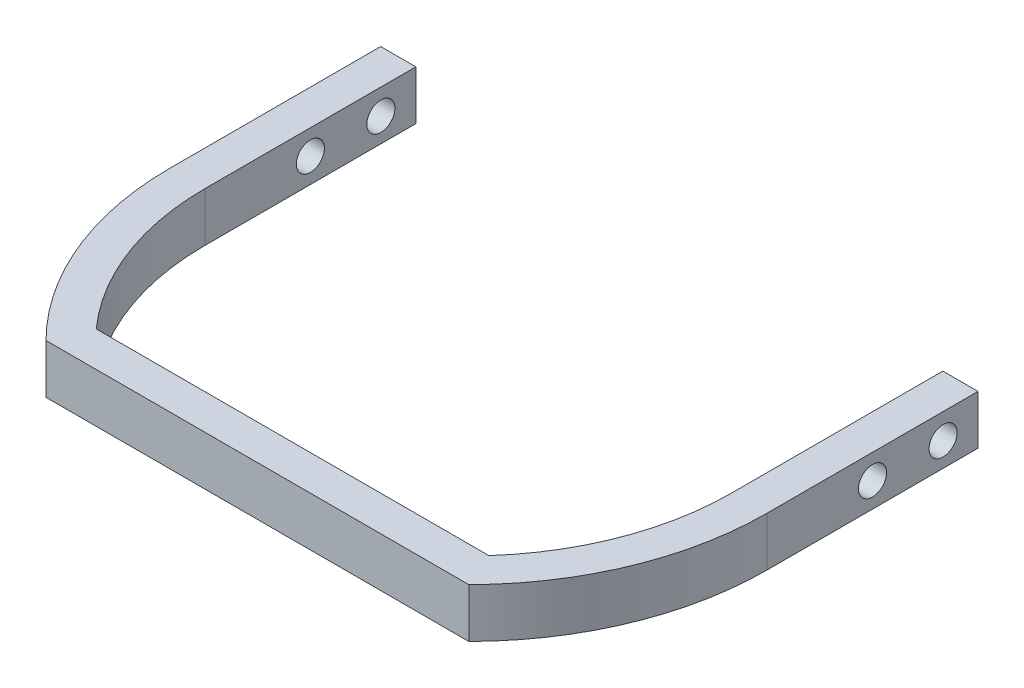
ISO-10303-21;
HEADER;
FILE_DESCRIPTION(('STEP AP214'),'2;1');
FILE_NAME('part.step','',(''),(''),'','','');
FILE_SCHEMA(('AUTOMOTIVE_DESIGN { 1 0 10303 214 1 1 1 1 }'));
ENDSEC;
DATA;
#1=APPLICATION_CONTEXT('core data for automotive mechanical design processes');
#2=APPLICATION_PROTOCOL_DEFINITION('international standard','automotive_design',2000,#1);
#3=PRODUCT_CONTEXT('',#1,'mechanical');
#4=PRODUCT('Part','Part','',(#3));
#5=PRODUCT_RELATED_PRODUCT_CATEGORY('part','',(#4));
#6=PRODUCT_DEFINITION_FORMATION('','',#4);
#7=PRODUCT_DEFINITION_CONTEXT('part definition',#1,'design');
#8=PRODUCT_DEFINITION('design','',#6,#7);
#9=PRODUCT_DEFINITION_SHAPE('','',#8);
#10=(LENGTH_UNIT() NAMED_UNIT(*) SI_UNIT(.MILLI.,.METRE.));
#11=(NAMED_UNIT(*) PLANE_ANGLE_UNIT() SI_UNIT($,.RADIAN.));
#12=(NAMED_UNIT(*) SI_UNIT($,.STERADIAN.) SOLID_ANGLE_UNIT());
#13=UNCERTAINTY_MEASURE_WITH_UNIT(LENGTH_MEASURE(1.E-05),#10,'distance_accuracy_value','');
#14=(GEOMETRIC_REPRESENTATION_CONTEXT(3) GLOBAL_UNCERTAINTY_ASSIGNED_CONTEXT((#13)) GLOBAL_UNIT_ASSIGNED_CONTEXT((#10,
#11,#12)) REPRESENTATION_CONTEXT('',''));
#15=CARTESIAN_POINT('',(0.,0.,0.));
#16=DIRECTION('',(0.,0.,1.));
#17=DIRECTION('',(1.,0.,0.));
#18=AXIS2_PLACEMENT_3D('',#15,#16,#17);
#19=CARTESIAN_POINT('',(-42.47,7.,-30.));
#20=DIRECTION('',(1.,0.,0.));
#21=DIRECTION('',(0.,0.,-1.));
#22=AXIS2_PLACEMENT_3D('',#19,#20,#21);
#23=PLANE('',#22);
#24=CARTESIAN_POINT('',(-42.47,3.49999999999986,-15.));
#25=DIRECTION('',(-1.,0.,0.));
#26=DIRECTION('',(0.,0.,1.));
#27=AXIS2_PLACEMENT_3D('',#24,#25,#26);
#28=CIRCLE('',#27,2.);
#29=CARTESIAN_POINT('',(-42.47,3.49999999999986,-13.));
#30=VERTEX_POINT('',#29);
#31=EDGE_CURVE('E186',#30,#30,#28,.T.);
#32=ORIENTED_EDGE('',*,*,#31,.F.);
#33=EDGE_LOOP('',(#32));
#34=FACE_BOUND('',#33,.T.);
#35=CARTESIAN_POINT('',(-42.47,3.40709277470034,-25.0330653049727));
#36=DIRECTION('',(-1.,0.,0.));
#37=DIRECTION('',(0.,0.,1.));
#38=AXIS2_PLACEMENT_3D('',#35,#36,#37);
#39=CIRCLE('',#38,2.);
#40=CARTESIAN_POINT('',(-42.47,3.40709277470034,-23.0330653049726));
#41=VERTEX_POINT('',#40);
#42=EDGE_CURVE('E177',#41,#41,#39,.T.);
#43=ORIENTED_EDGE('',*,*,#42,.F.);
#44=EDGE_LOOP('',(#43));
#45=FACE_BOUND('',#44,.T.);
#46=DIRECTION('',(0.,0.,1.));
#47=VECTOR('',#46,1.);
#48=CARTESIAN_POINT('',(-42.47,0.,-30.));
#49=LINE('',#48,#47);
#50=CARTESIAN_POINT('',(-42.47,0.,-30.));
#51=VERTEX_POINT('',#50);
#52=CARTESIAN_POINT('',(-42.47,0.,0.));
#53=VERTEX_POINT('',#52);
#54=EDGE_CURVE('E197',#51,#53,#49,.T.);
#55=ORIENTED_EDGE('',*,*,#54,.T.);
#56=DIRECTION('',(0.,-1.,0.));
#57=VECTOR('',#56,1.);
#58=CARTESIAN_POINT('',(-42.47,7.,0.));
#59=LINE('',#58,#57);
#60=CARTESIAN_POINT('',(-42.47,7.,0.));
#61=VERTEX_POINT('',#60);
#62=EDGE_CURVE('E11',#61,#53,#59,.T.);
#63=ORIENTED_EDGE('',*,*,#62,.F.);
#64=DIRECTION('',(0.,0.,1.));
#65=VECTOR('',#64,1.);
#66=CARTESIAN_POINT('',(-42.47,7.,-30.));
#67=LINE('',#66,#65);
#68=CARTESIAN_POINT('',(-42.47,7.,-30.));
#69=VERTEX_POINT('',#68);
#70=EDGE_CURVE('E79',#69,#61,#67,.T.);
#71=ORIENTED_EDGE('',*,*,#70,.F.);
#72=DIRECTION('',(0.,-1.,0.));
#73=VECTOR('',#72,1.);
#74=CARTESIAN_POINT('',(-42.47,7.,-30.));
#75=LINE('',#74,#73);
#76=EDGE_CURVE('E196',#69,#51,#75,.T.);
#77=ORIENTED_EDGE('',*,*,#76,.T.);
#78=EDGE_LOOP('',(#55,#63,#71,#77));
#79=FACE_BOUND('',#78,.T.);
#80=ADVANCED_FACE('F35',(#34,#45,#79),#23,.F.);
#81=CARTESIAN_POINT('',(-37.47,7.,-30.));
#82=DIRECTION('',(-1.,0.,0.));
#83=DIRECTION('',(0.,0.,1.));
#84=AXIS2_PLACEMENT_3D('',#81,#82,#83);
#85=PLANE('',#84);
#86=CARTESIAN_POINT('',(-37.47,3.49999999999986,-15.));
#87=DIRECTION('',(-1.,0.,0.));
#88=DIRECTION('',(0.,0.,1.));
#89=AXIS2_PLACEMENT_3D('',#86,#87,#88);
#90=CIRCLE('',#89,2.);
#91=CARTESIAN_POINT('',(-37.47,3.49999999999986,-13.));
#92=VERTEX_POINT('',#91);
#93=EDGE_CURVE('E38',#92,#92,#90,.T.);
#94=ORIENTED_EDGE('',*,*,#93,.T.);
#95=EDGE_LOOP('',(#94));
#96=FACE_BOUND('',#95,.T.);
#97=CARTESIAN_POINT('',(-37.47,3.40709277470034,-25.0330653049727));
#98=DIRECTION('',(-1.,0.,0.));
#99=DIRECTION('',(0.,0.,1.));
#100=AXIS2_PLACEMENT_3D('',#97,#98,#99);
#101=CIRCLE('',#100,2.);
#102=CARTESIAN_POINT('',(-37.47,3.40709277470034,-23.0330653049726));
#103=VERTEX_POINT('',#102);
#104=EDGE_CURVE('E189',#103,#103,#101,.T.);
#105=ORIENTED_EDGE('',*,*,#104,.T.);
#106=EDGE_LOOP('',(#105));
#107=FACE_BOUND('',#106,.T.);
#108=DIRECTION('',(0.,0.,-1.));
#109=VECTOR('',#108,1.);
#110=CARTESIAN_POINT('',(-37.47,0.,-30.));
#111=LINE('',#110,#109);
#112=CARTESIAN_POINT('',(-37.47,0.,0.));
#113=VERTEX_POINT('',#112);
#114=CARTESIAN_POINT('',(-37.47,0.,-30.));
#115=VERTEX_POINT('',#114);
#116=EDGE_CURVE('E68',#113,#115,#111,.T.);
#117=ORIENTED_EDGE('',*,*,#116,.T.);
#118=DIRECTION('',(0.,-1.,0.));
#119=VECTOR('',#118,1.);
#120=CARTESIAN_POINT('',(-37.47,7.,-30.));
#121=LINE('',#120,#119);
#122=CARTESIAN_POINT('',(-37.47,7.,-30.));
#123=VERTEX_POINT('',#122);
#124=EDGE_CURVE('E202',#123,#115,#121,.T.);
#125=ORIENTED_EDGE('',*,*,#124,.F.);
#126=DIRECTION('',(0.,0.,-1.));
#127=VECTOR('',#126,1.);
#128=CARTESIAN_POINT('',(-37.47,7.,-30.));
#129=LINE('',#128,#127);
#130=CARTESIAN_POINT('',(-37.47,7.,0.));
#131=VERTEX_POINT('',#130);
#132=EDGE_CURVE('E193',#131,#123,#129,.T.);
#133=ORIENTED_EDGE('',*,*,#132,.F.);
#134=DIRECTION('',(0.,-1.,0.));
#135=VECTOR('',#134,1.);
#136=CARTESIAN_POINT('',(-37.47,7.,0.));
#137=LINE('',#136,#135);
#138=EDGE_CURVE('E44',#131,#113,#137,.T.);
#139=ORIENTED_EDGE('',*,*,#138,.T.);
#140=EDGE_LOOP('',(#117,#125,#133,#139));
#141=FACE_BOUND('',#140,.T.);
#142=ADVANCED_FACE('F210',(#96,#107,#141),#85,.F.);
#143=CARTESIAN_POINT('',(-42.47,7.,-30.));
#144=DIRECTION('',(0.,0.,1.));
#145=DIRECTION('',(1.,0.,0.));
#146=AXIS2_PLACEMENT_3D('',#143,#144,#145);
#147=PLANE('',#146);
#148=DIRECTION('',(-1.,0.,0.));
#149=VECTOR('',#148,1.);
#150=CARTESIAN_POINT('',(-42.47,0.,-30.));
#151=LINE('',#150,#149);
#152=EDGE_CURVE('E74',#115,#51,#151,.T.);
#153=ORIENTED_EDGE('',*,*,#152,.T.);
#154=ORIENTED_EDGE('',*,*,#76,.F.);
#155=DIRECTION('',(-1.,0.,0.));
#156=VECTOR('',#155,1.);
#157=CARTESIAN_POINT('',(-42.47,7.,-30.));
#158=LINE('',#157,#156);
#159=EDGE_CURVE('E53',#123,#69,#158,.T.);
#160=ORIENTED_EDGE('',*,*,#159,.F.);
#161=ORIENTED_EDGE('',*,*,#124,.T.);
#162=EDGE_LOOP('',(#153,#154,#160,#161));
#163=FACE_BOUND('',#162,.T.);
#164=ADVANCED_FACE('F233',(#163),#147,.F.);
#165=CARTESIAN_POINT('',(0.,7.,0.));
#166=DIRECTION('',(0.,1.,0.));
#167=DIRECTION('',(0.,0.,1.));
#168=AXIS2_PLACEMENT_3D('',#165,#166,#167);
#169=PLANE('',#168);
#170=ORIENTED_EDGE('',*,*,#70,.T.);
#171=CARTESIAN_POINT('',(0.,7.,0.));
#172=DIRECTION('',(0.,1.,0.));
#173=DIRECTION('',(0.,0.,1.));
#174=AXIS2_PLACEMENT_3D('',#171,#172,#173);
#175=CIRCLE('',#174,42.47);
#176=CARTESIAN_POINT('',(-30.0616183862413,7.,30.));
#177=VERTEX_POINT('',#176);
#178=EDGE_CURVE('E172',#61,#177,#175,.T.);
#179=ORIENTED_EDGE('',*,*,#178,.T.);
#180=DIRECTION('',(-1.,0.,0.));
#181=VECTOR('',#180,1.);
#182=CARTESIAN_POINT('',(0.,7.,30.));
#183=LINE('',#182,#181);
#184=CARTESIAN_POINT('',(30.0616183862413,7.,30.));
#185=VERTEX_POINT('',#184);
#186=EDGE_CURVE('E166',#185,#177,#183,.T.);
#187=ORIENTED_EDGE('',*,*,#186,.F.);
#188=CARTESIAN_POINT('',(0.,7.,0.));
#189=DIRECTION('',(0.,1.,0.));
#190=DIRECTION('',(0.,0.,1.));
#191=AXIS2_PLACEMENT_3D('',#188,#189,#190);
#192=CIRCLE('',#191,42.47);
#193=CARTESIAN_POINT('',(42.47,7.,0.));
#194=VERTEX_POINT('',#193);
#195=EDGE_CURVE('E161',#185,#194,#192,.T.);
#196=ORIENTED_EDGE('',*,*,#195,.T.);
#197=DIRECTION('',(0.,0.,-1.));
#198=VECTOR('',#197,1.);
#199=CARTESIAN_POINT('',(42.47,7.,-30.));
#200=LINE('',#199,#198);
#201=CARTESIAN_POINT('',(42.47,7.,-30.));
#202=VERTEX_POINT('',#201);
#203=EDGE_CURVE('E145',#194,#202,#200,.T.);
#204=ORIENTED_EDGE('',*,*,#203,.T.);
#205=DIRECTION('',(-1.,0.,0.));
#206=VECTOR('',#205,1.);
#207=CARTESIAN_POINT('',(37.47,7.,-30.));
#208=LINE('',#207,#206);
#209=CARTESIAN_POINT('',(37.47,7.,-30.));
#210=VERTEX_POINT('',#209);
#211=EDGE_CURVE('E141',#202,#210,#208,.T.);
#212=ORIENTED_EDGE('',*,*,#211,.T.);
#213=DIRECTION('',(0.,0.,1.));
#214=VECTOR('',#213,1.);
#215=CARTESIAN_POINT('',(37.47,7.,-30.));
#216=LINE('',#215,#214);
#217=CARTESIAN_POINT('',(37.47,7.,0.));
#218=VERTEX_POINT('',#217);
#219=EDGE_CURVE('E133',#210,#218,#216,.T.);
#220=ORIENTED_EDGE('',*,*,#219,.T.);
#221=CARTESIAN_POINT('',(0.,7.,0.));
#222=DIRECTION('',(0.,1.,0.));
#223=DIRECTION('',(0.,0.,1.));
#224=AXIS2_PLACEMENT_3D('',#221,#222,#223);
#225=CIRCLE('',#224,37.47);
#226=CARTESIAN_POINT('',(27.9105875968243,7.,25.));
#227=VERTEX_POINT('',#226);
#228=EDGE_CURVE('E138',#227,#218,#225,.T.);
#229=ORIENTED_EDGE('',*,*,#228,.F.);
#230=DIRECTION('',(-1.,0.,0.));
#231=VECTOR('',#230,1.);
#232=CARTESIAN_POINT('',(0.,7.,25.));
#233=LINE('',#232,#231);
#234=CARTESIAN_POINT('',(-27.9105875968243,7.,25.));
#235=VERTEX_POINT('',#234);
#236=EDGE_CURVE('E160',#227,#235,#233,.T.);
#237=ORIENTED_EDGE('',*,*,#236,.T.);
#238=CARTESIAN_POINT('',(0.,7.,0.));
#239=DIRECTION('',(0.,1.,0.));
#240=DIRECTION('',(0.,0.,1.));
#241=AXIS2_PLACEMENT_3D('',#238,#239,#240);
#242=CIRCLE('',#241,37.47);
#243=EDGE_CURVE('E163',#131,#235,#242,.T.);
#244=ORIENTED_EDGE('',*,*,#243,.F.);
#245=ORIENTED_EDGE('',*,*,#132,.T.);
#246=ORIENTED_EDGE('',*,*,#159,.T.);
#247=EDGE_LOOP('',(#170,#179,#187,#196,#204,#212,#220,#229,#237,#244,#245,#246));
#248=FACE_BOUND('',#247,.T.);
#249=ADVANCED_FACE('F135',(#248),#169,.T.);
#250=CARTESIAN_POINT('',(0.,0.,0.));
#251=DIRECTION('',(0.,1.,0.));
#252=DIRECTION('',(0.,0.,1.));
#253=AXIS2_PLACEMENT_3D('',#250,#251,#252);
#254=PLANE('',#253);
#255=ORIENTED_EDGE('',*,*,#54,.F.);
#256=ORIENTED_EDGE('',*,*,#152,.F.);
#257=ORIENTED_EDGE('',*,*,#116,.F.);
#258=CARTESIAN_POINT('',(0.,0.,0.));
#259=DIRECTION('',(0.,1.,0.));
#260=DIRECTION('',(0.,0.,1.));
#261=AXIS2_PLACEMENT_3D('',#258,#259,#260);
#262=CIRCLE('',#261,37.47);
#263=CARTESIAN_POINT('',(-27.9105875968243,0.,25.));
#264=VERTEX_POINT('',#263);
#265=EDGE_CURVE('E247',#113,#264,#262,.T.);
#266=ORIENTED_EDGE('',*,*,#265,.T.);
#267=DIRECTION('',(-1.,0.,0.));
#268=VECTOR('',#267,1.);
#269=CARTESIAN_POINT('',(0.,0.,25.));
#270=LINE('',#269,#268);
#271=CARTESIAN_POINT('',(27.9105875968243,0.,25.));
#272=VERTEX_POINT('',#271);
#273=EDGE_CURVE('E249',#272,#264,#270,.T.);
#274=ORIENTED_EDGE('',*,*,#273,.F.);
#275=CARTESIAN_POINT('',(0.,0.,0.));
#276=DIRECTION('',(0.,1.,0.));
#277=DIRECTION('',(0.,0.,1.));
#278=AXIS2_PLACEMENT_3D('',#275,#276,#277);
#279=CIRCLE('',#278,37.47);
#280=CARTESIAN_POINT('',(37.47,0.,0.));
#281=VERTEX_POINT('',#280);
#282=EDGE_CURVE('E268',#272,#281,#279,.T.);
#283=ORIENTED_EDGE('',*,*,#282,.T.);
#284=DIRECTION('',(0.,0.,1.));
#285=VECTOR('',#284,1.);
#286=CARTESIAN_POINT('',(37.47,0.,-30.));
#287=LINE('',#286,#285);
#288=CARTESIAN_POINT('',(37.47,0.,-30.));
#289=VERTEX_POINT('',#288);
#290=EDGE_CURVE('E152',#289,#281,#287,.T.);
#291=ORIENTED_EDGE('',*,*,#290,.F.);
#292=DIRECTION('',(-1.,0.,0.));
#293=VECTOR('',#292,1.);
#294=CARTESIAN_POINT('',(37.47,0.,-30.));
#295=LINE('',#294,#293);
#296=CARTESIAN_POINT('',(42.47,0.,-30.));
#297=VERTEX_POINT('',#296);
#298=EDGE_CURVE('E146',#297,#289,#295,.T.);
#299=ORIENTED_EDGE('',*,*,#298,.F.);
#300=DIRECTION('',(0.,0.,-1.));
#301=VECTOR('',#300,1.);
#302=CARTESIAN_POINT('',(42.47,0.,-30.));
#303=LINE('',#302,#301);
#304=CARTESIAN_POINT('',(42.47,0.,0.));
#305=VERTEX_POINT('',#304);
#306=EDGE_CURVE('E447',#305,#297,#303,.T.);
#307=ORIENTED_EDGE('',*,*,#306,.F.);
#308=CARTESIAN_POINT('',(0.,0.,0.));
#309=DIRECTION('',(0.,1.,0.));
#310=DIRECTION('',(0.,0.,1.));
#311=AXIS2_PLACEMENT_3D('',#308,#309,#310);
#312=CIRCLE('',#311,42.47);
#313=CARTESIAN_POINT('',(30.0616183862413,0.,30.));
#314=VERTEX_POINT('',#313);
#315=EDGE_CURVE('E265',#314,#305,#312,.T.);
#316=ORIENTED_EDGE('',*,*,#315,.F.);
#317=DIRECTION('',(-1.,0.,0.));
#318=VECTOR('',#317,1.);
#319=CARTESIAN_POINT('',(0.,0.,30.));
#320=LINE('',#319,#318);
#321=CARTESIAN_POINT('',(-30.0616183862413,0.,30.));
#322=VERTEX_POINT('',#321);
#323=EDGE_CURVE('E174',#314,#322,#320,.T.);
#324=ORIENTED_EDGE('',*,*,#323,.T.);
#325=CARTESIAN_POINT('',(0.,0.,0.));
#326=DIRECTION('',(0.,1.,0.));
#327=DIRECTION('',(0.,0.,1.));
#328=AXIS2_PLACEMENT_3D('',#325,#326,#327);
#329=CIRCLE('',#328,42.47);
#330=EDGE_CURVE('E185',#53,#322,#329,.T.);
#331=ORIENTED_EDGE('',*,*,#330,.F.);
#332=EDGE_LOOP('',(#255,#256,#257,#266,#274,#283,#291,#299,#307,#316,#324,#331));
#333=FACE_BOUND('',#332,.T.);
#334=ADVANCED_FACE('F225',(#333),#254,.F.);
#335=CARTESIAN_POINT('',(42.47,3.40709277470034,-25.0330653049727));
#336=DIRECTION('',(-1.,0.,0.));
#337=DIRECTION('',(0.,0.,1.));
#338=AXIS2_PLACEMENT_3D('',#335,#336,#337);
#339=CYLINDRICAL_SURFACE('',#338,2.);
#340=ORIENTED_EDGE('',*,*,#42,.T.);
#341=EDGE_LOOP('',(#340));
#342=FACE_BOUND('',#341,.T.);
#343=ORIENTED_EDGE('',*,*,#104,.F.);
#344=EDGE_LOOP('',(#343));
#345=FACE_BOUND('',#344,.T.);
#346=ADVANCED_FACE('F215',(#342,#345),#339,.F.);
#347=CARTESIAN_POINT('',(42.47,3.49999999999986,-15.));
#348=DIRECTION('',(-1.,0.,0.));
#349=DIRECTION('',(0.,0.,1.));
#350=AXIS2_PLACEMENT_3D('',#347,#348,#349);
#351=CYLINDRICAL_SURFACE('',#350,2.);
#352=ORIENTED_EDGE('',*,*,#31,.T.);
#353=EDGE_LOOP('',(#352));
#354=FACE_BOUND('',#353,.T.);
#355=ORIENTED_EDGE('',*,*,#93,.F.);
#356=EDGE_LOOP('',(#355));
#357=FACE_BOUND('',#356,.T.);
#358=ADVANCED_FACE('F212',(#354,#357),#351,.F.);
#359=CARTESIAN_POINT('',(0.,0.,30.));
#360=DIRECTION('',(0.,0.,-1.));
#361=DIRECTION('',(-1.,0.,0.));
#362=AXIS2_PLACEMENT_3D('',#359,#360,#361);
#363=PLANE('',#362);
#364=ORIENTED_EDGE('',*,*,#186,.T.);
#365=DIRECTION('',(0.,1.,0.));
#366=VECTOR('',#365,1.);
#367=CARTESIAN_POINT('',(-30.0616183862413,0.,30.));
#368=LINE('',#367,#366);
#369=EDGE_CURVE('E175',#322,#177,#368,.T.);
#370=ORIENTED_EDGE('',*,*,#369,.F.);
#371=ORIENTED_EDGE('',*,*,#323,.F.);
#372=DIRECTION('',(0.,1.,0.));
#373=VECTOR('',#372,1.);
#374=CARTESIAN_POINT('',(30.0616183862413,0.,30.));
#375=LINE('',#374,#373);
#376=EDGE_CURVE('E183',#314,#185,#375,.T.);
#377=ORIENTED_EDGE('',*,*,#376,.T.);
#378=EDGE_LOOP('',(#364,#370,#371,#377));
#379=FACE_BOUND('',#378,.T.);
#380=ADVANCED_FACE('F214',(#379),#363,.F.);
#381=CARTESIAN_POINT('',(0.,0.,0.));
#382=DIRECTION('',(0.,1.,0.));
#383=DIRECTION('',(0.,0.,1.));
#384=AXIS2_PLACEMENT_3D('',#381,#382,#383);
#385=CYLINDRICAL_SURFACE('',#384,42.47);
#386=ORIENTED_EDGE('',*,*,#178,.F.);
#387=ORIENTED_EDGE('',*,*,#62,.T.);
#388=ORIENTED_EDGE('',*,*,#330,.T.);
#389=ORIENTED_EDGE('',*,*,#369,.T.);
#390=EDGE_LOOP('',(#386,#387,#388,#389));
#391=FACE_BOUND('',#390,.T.);
#392=ADVANCED_FACE('F222',(#391),#385,.T.);
#393=CARTESIAN_POINT('',(0.,0.,0.));
#394=DIRECTION('',(0.,1.,0.));
#395=DIRECTION('',(0.,0.,1.));
#396=AXIS2_PLACEMENT_3D('',#393,#394,#395);
#397=CYLINDRICAL_SURFACE('',#396,37.47);
#398=ORIENTED_EDGE('',*,*,#243,.T.);
#399=DIRECTION('',(0.,1.,0.));
#400=VECTOR('',#399,1.);
#401=CARTESIAN_POINT('',(-27.9105875968243,0.,25.));
#402=LINE('',#401,#400);
#403=EDGE_CURVE('E178',#264,#235,#402,.T.);
#404=ORIENTED_EDGE('',*,*,#403,.F.);
#405=ORIENTED_EDGE('',*,*,#265,.F.);
#406=ORIENTED_EDGE('',*,*,#138,.F.);
#407=EDGE_LOOP('',(#398,#404,#405,#406));
#408=FACE_BOUND('',#407,.T.);
#409=ADVANCED_FACE('F277',(#408),#397,.F.);
#410=CARTESIAN_POINT('',(0.,0.,25.));
#411=DIRECTION('',(0.,0.,-1.));
#412=DIRECTION('',(-1.,0.,0.));
#413=AXIS2_PLACEMENT_3D('',#410,#411,#412);
#414=PLANE('',#413);
#415=ORIENTED_EDGE('',*,*,#236,.F.);
#416=DIRECTION('',(0.,1.,0.));
#417=VECTOR('',#416,1.);
#418=CARTESIAN_POINT('',(27.9105875968243,0.,25.));
#419=LINE('',#418,#417);
#420=EDGE_CURVE('E156',#272,#227,#419,.T.);
#421=ORIENTED_EDGE('',*,*,#420,.F.);
#422=ORIENTED_EDGE('',*,*,#273,.T.);
#423=ORIENTED_EDGE('',*,*,#403,.T.);
#424=EDGE_LOOP('',(#415,#421,#422,#423));
#425=FACE_BOUND('',#424,.T.);
#426=ADVANCED_FACE('F272',(#425),#414,.T.);
#427=CARTESIAN_POINT('',(0.,0.,0.));
#428=DIRECTION('',(0.,1.,0.));
#429=DIRECTION('',(0.,0.,1.));
#430=AXIS2_PLACEMENT_3D('',#427,#428,#429);
#431=CYLINDRICAL_SURFACE('',#430,37.47);
#432=ORIENTED_EDGE('',*,*,#228,.T.);
#433=DIRECTION('',(0.,1.,0.));
#434=VECTOR('',#433,1.);
#435=CARTESIAN_POINT('',(37.47,0.,0.));
#436=LINE('',#435,#434);
#437=EDGE_CURVE('E149',#281,#218,#436,.T.);
#438=ORIENTED_EDGE('',*,*,#437,.F.);
#439=ORIENTED_EDGE('',*,*,#282,.F.);
#440=ORIENTED_EDGE('',*,*,#420,.T.);
#441=EDGE_LOOP('',(#432,#438,#439,#440));
#442=FACE_BOUND('',#441,.T.);
#443=ADVANCED_FACE('F159',(#442),#431,.F.);
#444=CARTESIAN_POINT('',(0.,0.,0.));
#445=DIRECTION('',(0.,1.,0.));
#446=DIRECTION('',(0.,0.,1.));
#447=AXIS2_PLACEMENT_3D('',#444,#445,#446);
#448=CYLINDRICAL_SURFACE('',#447,42.47);
#449=ORIENTED_EDGE('',*,*,#195,.F.);
#450=ORIENTED_EDGE('',*,*,#376,.F.);
#451=ORIENTED_EDGE('',*,*,#315,.T.);
#452=DIRECTION('',(0.,1.,0.));
#453=VECTOR('',#452,1.);
#454=CARTESIAN_POINT('',(42.47,0.,0.));
#455=LINE('',#454,#453);
#456=EDGE_CURVE('E157',#305,#194,#455,.T.);
#457=ORIENTED_EDGE('',*,*,#456,.T.);
#458=EDGE_LOOP('',(#449,#450,#451,#457));
#459=FACE_BOUND('',#458,.T.);
#460=ADVANCED_FACE('F316',(#459),#448,.T.);
#461=CARTESIAN_POINT('',(37.47,7.,-30.));
#462=DIRECTION('',(1.,0.,0.));
#463=DIRECTION('',(0.,0.,-1.));
#464=AXIS2_PLACEMENT_3D('',#461,#462,#463);
#465=PLANE('',#464);
#466=CARTESIAN_POINT('',(37.47,3.49999999999986,-15.));
#467=DIRECTION('',(1.,0.,0.));
#468=DIRECTION('',(0.,0.,-1.));
#469=AXIS2_PLACEMENT_3D('',#466,#467,#468);
#470=CIRCLE('',#469,2.);
#471=CARTESIAN_POINT('',(37.47,3.49999999999986,-17.));
#472=VERTEX_POINT('',#471);
#473=EDGE_CURVE('E451',#472,#472,#470,.T.);
#474=ORIENTED_EDGE('',*,*,#473,.T.);
#475=EDGE_LOOP('',(#474));
#476=FACE_BOUND('',#475,.T.);
#477=CARTESIAN_POINT('',(37.47,3.40709277470034,-25.0330653049727));
#478=DIRECTION('',(1.,0.,0.));
#479=DIRECTION('',(0.,0.,-1.));
#480=AXIS2_PLACEMENT_3D('',#477,#478,#479);
#481=CIRCLE('',#480,2.);
#482=CARTESIAN_POINT('',(37.47,3.40709277470034,-27.0330653049727));
#483=VERTEX_POINT('',#482);
#484=EDGE_CURVE('E453',#483,#483,#481,.T.);
#485=ORIENTED_EDGE('',*,*,#484,.T.);
#486=EDGE_LOOP('',(#485));
#487=FACE_BOUND('',#486,.T.);
#488=ORIENTED_EDGE('',*,*,#290,.T.);
#489=ORIENTED_EDGE('',*,*,#437,.T.);
#490=ORIENTED_EDGE('',*,*,#219,.F.);
#491=DIRECTION('',(0.,-1.,0.));
#492=VECTOR('',#491,1.);
#493=CARTESIAN_POINT('',(37.47,7.,-30.));
#494=LINE('',#493,#492);
#495=EDGE_CURVE('E256',#210,#289,#494,.T.);
#496=ORIENTED_EDGE('',*,*,#495,.T.);
#497=EDGE_LOOP('',(#488,#489,#490,#496));
#498=FACE_BOUND('',#497,.T.);
#499=ADVANCED_FACE('F150',(#476,#487,#498),#465,.F.);
#500=CARTESIAN_POINT('',(42.47,7.,-30.));
#501=DIRECTION('',(-1.,0.,0.));
#502=DIRECTION('',(0.,0.,1.));
#503=AXIS2_PLACEMENT_3D('',#500,#501,#502);
#504=PLANE('',#503);
#505=CARTESIAN_POINT('',(42.47,3.49999999999986,-15.));
#506=DIRECTION('',(-1.,0.,0.));
#507=DIRECTION('',(0.,0.,1.));
#508=AXIS2_PLACEMENT_3D('',#505,#506,#507);
#509=CIRCLE('',#508,2.);
#510=CARTESIAN_POINT('',(42.47,3.49999999999986,-13.));
#511=VERTEX_POINT('',#510);
#512=EDGE_CURVE('E457',#511,#511,#509,.T.);
#513=ORIENTED_EDGE('',*,*,#512,.T.);
#514=EDGE_LOOP('',(#513));
#515=FACE_BOUND('',#514,.T.);
#516=CARTESIAN_POINT('',(42.47,3.40709277470034,-25.0330653049727));
#517=DIRECTION('',(-1.,0.,0.));
#518=DIRECTION('',(0.,0.,1.));
#519=AXIS2_PLACEMENT_3D('',#516,#517,#518);
#520=CIRCLE('',#519,2.);
#521=CARTESIAN_POINT('',(42.47,3.40709277470034,-23.0330653049726));
#522=VERTEX_POINT('',#521);
#523=EDGE_CURVE('E460',#522,#522,#520,.T.);
#524=ORIENTED_EDGE('',*,*,#523,.T.);
#525=EDGE_LOOP('',(#524));
#526=FACE_BOUND('',#525,.T.);
#527=ORIENTED_EDGE('',*,*,#306,.T.);
#528=DIRECTION('',(0.,-1.,0.));
#529=VECTOR('',#528,1.);
#530=CARTESIAN_POINT('',(42.47,7.,-30.));
#531=LINE('',#530,#529);
#532=EDGE_CURVE('E253',#202,#297,#531,.T.);
#533=ORIENTED_EDGE('',*,*,#532,.F.);
#534=ORIENTED_EDGE('',*,*,#203,.F.);
#535=ORIENTED_EDGE('',*,*,#456,.F.);
#536=EDGE_LOOP('',(#527,#533,#534,#535));
#537=FACE_BOUND('',#536,.T.);
#538=ADVANCED_FACE('F315',(#515,#526,#537),#504,.F.);
#539=CARTESIAN_POINT('',(37.47,7.,-30.));
#540=DIRECTION('',(0.,0.,1.));
#541=DIRECTION('',(1.,0.,0.));
#542=AXIS2_PLACEMENT_3D('',#539,#540,#541);
#543=PLANE('',#542);
#544=ORIENTED_EDGE('',*,*,#298,.T.);
#545=ORIENTED_EDGE('',*,*,#495,.F.);
#546=ORIENTED_EDGE('',*,*,#211,.F.);
#547=ORIENTED_EDGE('',*,*,#532,.T.);
#548=EDGE_LOOP('',(#544,#545,#546,#547));
#549=FACE_BOUND('',#548,.T.);
#550=ADVANCED_FACE('F327',(#549),#543,.F.);
#551=CARTESIAN_POINT('',(42.47,3.40709277470034,-25.0330653049727));
#552=DIRECTION('',(-1.,0.,0.));
#553=DIRECTION('',(0.,0.,1.));
#554=AXIS2_PLACEMENT_3D('',#551,#552,#553);
#555=CYLINDRICAL_SURFACE('',#554,2.);
#556=ORIENTED_EDGE('',*,*,#523,.F.);
#557=EDGE_LOOP('',(#556));
#558=FACE_BOUND('',#557,.T.);
#559=ORIENTED_EDGE('',*,*,#484,.F.);
#560=EDGE_LOOP('',(#559));
#561=FACE_BOUND('',#560,.T.);
#562=ADVANCED_FACE('F336',(#558,#561),#555,.F.);
#563=CARTESIAN_POINT('',(42.47,3.49999999999986,-15.));
#564=DIRECTION('',(-1.,0.,0.));
#565=DIRECTION('',(0.,0.,1.));
#566=AXIS2_PLACEMENT_3D('',#563,#564,#565);
#567=CYLINDRICAL_SURFACE('',#566,2.);
#568=ORIENTED_EDGE('',*,*,#512,.F.);
#569=EDGE_LOOP('',(#568));
#570=FACE_BOUND('',#569,.T.);
#571=ORIENTED_EDGE('',*,*,#473,.F.);
#572=EDGE_LOOP('',(#571));
#573=FACE_BOUND('',#572,.T.);
#574=ADVANCED_FACE('F345',(#570,#573),#567,.F.);
#575=CLOSED_SHELL('',(#80,#142,#164,#249,#334,#346,#358,#380,#392,#409,#426,#443,#460,#499,#538,
#550,#562,#574));
#576=MANIFOLD_SOLID_BREP('B2',#575);
#577=ADVANCED_BREP_SHAPE_REPRESENTATION('',(#18,#576),#14);
#578=SHAPE_DEFINITION_REPRESENTATION(#9,#577);
ENDSEC;
END-ISO-10303-21;
